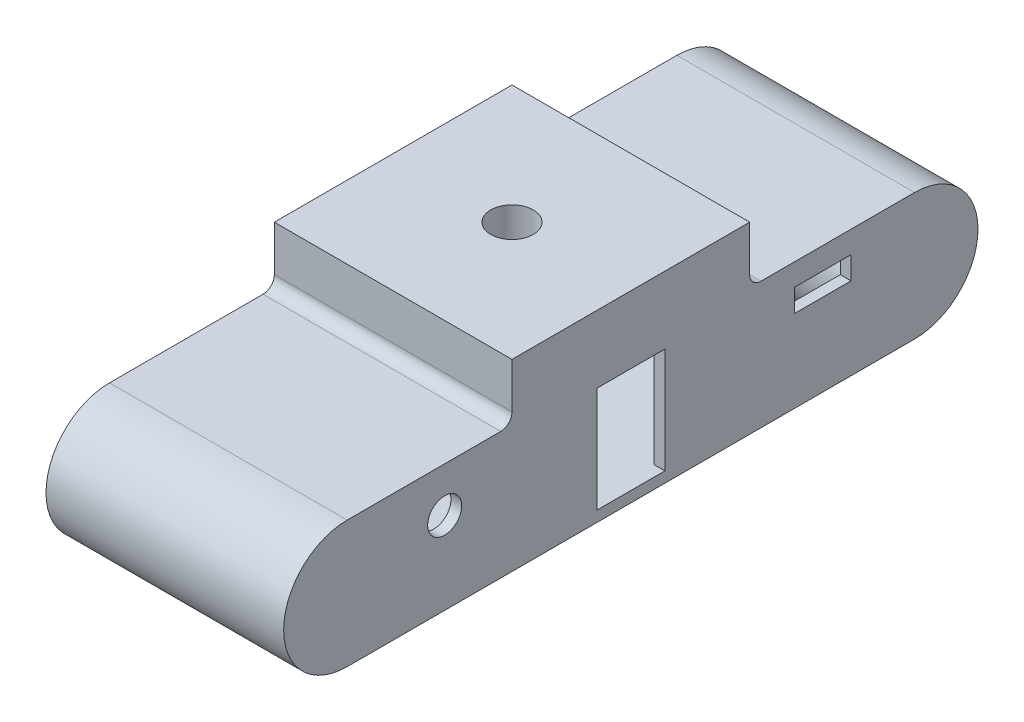
ISO-10303-21;
HEADER;
FILE_DESCRIPTION(('STEP AP214'),'2;1');
FILE_NAME('part.step','',(''),(''),'','','');
FILE_SCHEMA(('AUTOMOTIVE_DESIGN { 1 0 10303 214 1 1 1 1 }'));
ENDSEC;
DATA;
#1=APPLICATION_CONTEXT('core data for automotive mechanical design processes');
#2=APPLICATION_PROTOCOL_DEFINITION('international standard','automotive_design',2000,#1);
#3=PRODUCT_CONTEXT('',#1,'mechanical');
#4=PRODUCT('Part','Part','',(#3));
#5=PRODUCT_RELATED_PRODUCT_CATEGORY('part','',(#4));
#6=PRODUCT_DEFINITION_FORMATION('','',#4);
#7=PRODUCT_DEFINITION_CONTEXT('part definition',#1,'design');
#8=PRODUCT_DEFINITION('design','',#6,#7);
#9=PRODUCT_DEFINITION_SHAPE('','',#8);
#10=(LENGTH_UNIT() NAMED_UNIT(*) SI_UNIT(.MILLI.,.METRE.));
#11=(NAMED_UNIT(*) PLANE_ANGLE_UNIT() SI_UNIT($,.RADIAN.));
#12=(NAMED_UNIT(*) SI_UNIT($,.STERADIAN.) SOLID_ANGLE_UNIT());
#13=UNCERTAINTY_MEASURE_WITH_UNIT(LENGTH_MEASURE(1.E-05),#10,'distance_accuracy_value','');
#14=(GEOMETRIC_REPRESENTATION_CONTEXT(3) GLOBAL_UNCERTAINTY_ASSIGNED_CONTEXT((#13)) GLOBAL_UNIT_ASSIGNED_CONTEXT((#10,
#11,#12)) REPRESENTATION_CONTEXT('',''));
#15=CARTESIAN_POINT('',(0.,0.,0.));
#16=DIRECTION('',(0.,0.,1.));
#17=DIRECTION('',(1.,0.,0.));
#18=AXIS2_PLACEMENT_3D('',#15,#16,#17);
#19=CARTESIAN_POINT('',(50.8,14.210999772,63.5));
#20=DIRECTION('',(0.,-1.,0.));
#21=DIRECTION('',(0.,0.,-1.));
#22=AXIS2_PLACEMENT_3D('',#19,#20,#21);
#23=PLANE('',#22);
#24=DIRECTION('',(0.,0.,1.));
#25=VECTOR('',#24,1.);
#26=CARTESIAN_POINT('',(53.199999772,14.210999772,-63.5));
#27=LINE('',#26,#25);
#28=CARTESIAN_POINT('',(53.199999772,14.210999772,29.139999886));
#29=VERTEX_POINT('',#28);
#30=CARTESIAN_POINT('',(53.199999772,14.210999772,63.5));
#31=VERTEX_POINT('',#30);
#32=EDGE_CURVE('E282',#29,#31,#27,.T.);
#33=ORIENTED_EDGE('',*,*,#32,.F.);
#34=DIRECTION('',(1.,0.,0.));
#35=VECTOR('',#34,1.);
#36=CARTESIAN_POINT('',(0.,14.210999772,29.139999886));
#37=LINE('',#36,#35);
#38=CARTESIAN_POINT('',(0.,14.210999772,29.139999886));
#39=VERTEX_POINT('',#38);
#40=EDGE_CURVE('E420',#29,#39,#37,.F.);
#41=ORIENTED_EDGE('',*,*,#40,.T.);
#42=DIRECTION('',(0.,0.,1.));
#43=VECTOR('',#42,1.);
#44=CARTESIAN_POINT('',(0.,14.210999772,63.5));
#45=LINE('',#44,#43);
#46=CARTESIAN_POINT('',(0.,14.210999772,63.5));
#47=VERTEX_POINT('',#46);
#48=EDGE_CURVE('E368',#39,#47,#45,.T.);
#49=ORIENTED_EDGE('',*,*,#48,.T.);
#50=DIRECTION('',(-1.,0.,0.));
#51=VECTOR('',#50,1.);
#52=CARTESIAN_POINT('',(50.8,14.210999772,63.5));
#53=LINE('',#52,#51);
#54=EDGE_CURVE('E372',#31,#47,#53,.T.);
#55=ORIENTED_EDGE('',*,*,#54,.F.);
#56=EDGE_LOOP('',(#33,#41,#49,#55));
#57=FACE_BOUND('',#56,.T.);
#58=ADVANCED_FACE('F39',(#57),#23,.F.);
#59=CARTESIAN_POINT('',(0.,14.210999772,-63.5));
#60=VERTEX_POINT('',#59);
#61=CARTESIAN_POINT('',(0.,14.210999772,-29.139999886));
#62=VERTEX_POINT('',#61);
#63=EDGE_CURVE('E369',#60,#62,#45,.T.);
#64=ORIENTED_EDGE('',*,*,#63,.T.);
#65=DIRECTION('',(-1.,0.,0.));
#66=VECTOR('',#65,1.);
#67=CARTESIAN_POINT('',(53.199999772,14.210999772,-29.139999886));
#68=LINE('',#67,#66);
#69=CARTESIAN_POINT('',(53.199999772,14.210999772,-29.139999886));
#70=VERTEX_POINT('',#69);
#71=EDGE_CURVE('E61',#62,#70,#68,.F.);
#72=ORIENTED_EDGE('',*,*,#71,.T.);
#73=CARTESIAN_POINT('',(53.199999772,14.210999772,-63.5));
#74=VERTEX_POINT('',#73);
#75=EDGE_CURVE('E283',#74,#70,#27,.T.);
#76=ORIENTED_EDGE('',*,*,#75,.F.);
#77=DIRECTION('',(-1.,0.,0.));
#78=VECTOR('',#77,1.);
#79=CARTESIAN_POINT('',(50.8,14.210999772,-63.5));
#80=LINE('',#79,#78);
#81=EDGE_CURVE('E376',#74,#60,#80,.T.);
#82=ORIENTED_EDGE('',*,*,#81,.T.);
#83=EDGE_LOOP('',(#64,#72,#76,#82));
#84=FACE_BOUND('',#83,.T.);
#85=ADVANCED_FACE('F454',(#84),#23,.F.);
#86=CARTESIAN_POINT('',(50.8,0.,-63.5));
#87=DIRECTION('',(1.,0.,0.));
#88=DIRECTION('',(0.,0.,-1.));
#89=AXIS2_PLACEMENT_3D('',#86,#87,#88);
#90=PLANE('',#89);
#91=DIRECTION('',(0.,0.,1.));
#92=VECTOR('',#91,1.);
#93=CARTESIAN_POINT('',(50.8,4.191,-49.289000228));
#94=LINE('',#93,#92);
#95=CARTESIAN_POINT('',(50.8,4.191,-49.289000228));
#96=VERTEX_POINT('',#95);
#97=CARTESIAN_POINT('',(50.8,4.191,-36.589000228));
#98=VERTEX_POINT('',#97);
#99=EDGE_CURVE('E233',#96,#98,#94,.T.);
#100=ORIENTED_EDGE('',*,*,#99,.F.);
#101=DIRECTION('',(0.,-1.,0.));
#102=VECTOR('',#101,1.);
#103=CARTESIAN_POINT('',(50.8,4.191,-49.289000228));
#104=LINE('',#103,#102);
#105=CARTESIAN_POINT('',(50.8,9.271,-49.289000228));
#106=VERTEX_POINT('',#105);
#107=EDGE_CURVE('E230',#106,#96,#104,.T.);
#108=ORIENTED_EDGE('',*,*,#107,.F.);
#109=DIRECTION('',(0.,0.,-1.));
#110=VECTOR('',#109,1.);
#111=CARTESIAN_POINT('',(50.8,9.271,-49.289000228));
#112=LINE('',#111,#110);
#113=CARTESIAN_POINT('',(50.8,9.271,-36.589000228));
#114=VERTEX_POINT('',#113);
#115=EDGE_CURVE('E242',#114,#106,#112,.T.);
#116=ORIENTED_EDGE('',*,*,#115,.F.);
#117=DIRECTION('',(0.,1.,0.));
#118=VECTOR('',#117,1.);
#119=CARTESIAN_POINT('',(50.8,4.191,-36.589000228));
#120=LINE('',#119,#118);
#121=EDGE_CURVE('E238',#98,#114,#120,.T.);
#122=ORIENTED_EDGE('',*,*,#121,.F.);
#123=EDGE_LOOP('',(#100,#108,#116,#122));
#124=FACE_BOUND('',#123,.T.);
#125=DIRECTION('',(0.,-1.,0.));
#126=VECTOR('',#125,1.);
#127=CARTESIAN_POINT('',(50.8,11.811,-7.62));
#128=LINE('',#127,#126);
#129=CARTESIAN_POINT('',(50.8,11.811,-7.62));
#130=VERTEX_POINT('',#129);
#131=CARTESIAN_POINT('',(50.8,-11.811,-7.62));
#132=VERTEX_POINT('',#131);
#133=EDGE_CURVE('E219',#130,#132,#128,.T.);
#134=ORIENTED_EDGE('',*,*,#133,.F.);
#135=DIRECTION('',(0.,0.,1.));
#136=VECTOR('',#135,1.);
#137=CARTESIAN_POINT('',(50.8,11.811,55.5972920135067));
#138=LINE('',#137,#136);
#139=CARTESIAN_POINT('',(50.8,11.811,-55.5972920135067));
#140=VERTEX_POINT('',#139);
#141=EDGE_CURVE('E310',#140,#130,#138,.T.);
#142=ORIENTED_EDGE('',*,*,#141,.F.);
#143=CARTESIAN_POINT('',(50.8,0.,-63.5));
#144=DIRECTION('',(-1.,0.,0.));
#145=DIRECTION('',(0.,0.,-1.));
#146=AXIS2_PLACEMENT_3D('',#143,#144,#145);
#147=CIRCLE('',#146,14.210999772);
#148=CARTESIAN_POINT('',(50.8,-11.811,-55.5972920135067));
#149=VERTEX_POINT('',#148);
#150=EDGE_CURVE('E305',#149,#140,#147,.T.);
#151=ORIENTED_EDGE('',*,*,#150,.F.);
#152=DIRECTION('',(0.,0.,-1.));
#153=VECTOR('',#152,1.);
#154=CARTESIAN_POINT('',(50.8,-11.811,55.5972920135067));
#155=LINE('',#154,#153);
#156=EDGE_CURVE('E299',#132,#149,#155,.T.);
#157=ORIENTED_EDGE('',*,*,#156,.F.);
#158=EDGE_LOOP('',(#134,#142,#151,#157));
#159=FACE_BOUND('',#158,.T.);
#160=ADVANCED_FACE('F496',(#124,#159),#90,.F.);
#161=CARTESIAN_POINT('',(50.8,4.191,41.669000228));
#162=DIRECTION('',(-1.,0.,0.));
#163=DIRECTION('',(0.,0.,1.));
#164=AXIS2_PLACEMENT_3D('',#161,#162,#163);
#165=CIRCLE('',#164,3.81);
#166=CARTESIAN_POINT('',(50.8,4.191,45.479000228));
#167=VERTEX_POINT('',#166);
#168=EDGE_CURVE('E234',#167,#167,#165,.T.);
#169=ORIENTED_EDGE('',*,*,#168,.F.);
#170=EDGE_LOOP('',(#169));
#171=FACE_BOUND('',#170,.T.);
#172=DIRECTION('',(0.,1.,0.));
#173=VECTOR('',#172,1.);
#174=CARTESIAN_POINT('',(50.8,11.811,7.62));
#175=LINE('',#174,#173);
#176=CARTESIAN_POINT('',(50.8,-11.811,7.62));
#177=VERTEX_POINT('',#176);
#178=CARTESIAN_POINT('',(50.8,11.811,7.62));
#179=VERTEX_POINT('',#178);
#180=EDGE_CURVE('E224',#177,#179,#175,.T.);
#181=ORIENTED_EDGE('',*,*,#180,.F.);
#182=CARTESIAN_POINT('',(50.8,-11.811,55.5972920135067));
#183=VERTEX_POINT('',#182);
#184=EDGE_CURVE('E301',#183,#177,#155,.T.);
#185=ORIENTED_EDGE('',*,*,#184,.F.);
#186=CARTESIAN_POINT('',(50.8,0.,63.5));
#187=DIRECTION('',(-1.,0.,0.));
#188=DIRECTION('',(0.,0.,-1.));
#189=AXIS2_PLACEMENT_3D('',#186,#187,#188);
#190=CIRCLE('',#189,14.210999772);
#191=CARTESIAN_POINT('',(50.8,11.811,55.5972920135067));
#192=VERTEX_POINT('',#191);
#193=EDGE_CURVE('E295',#192,#183,#190,.T.);
#194=ORIENTED_EDGE('',*,*,#193,.F.);
#195=EDGE_CURVE('E309',#179,#192,#138,.T.);
#196=ORIENTED_EDGE('',*,*,#195,.F.);
#197=EDGE_LOOP('',(#181,#185,#194,#196));
#198=FACE_BOUND('',#197,.T.);
#199=ADVANCED_FACE('F558',(#171,#198),#90,.F.);
#200=CARTESIAN_POINT('',(0.,0.,63.5));
#201=DIRECTION('',(1.,0.,0.));
#202=DIRECTION('',(0.,0.,-1.));
#203=AXIS2_PLACEMENT_3D('',#200,#201,#202);
#204=PLANE('',#203);
#205=CARTESIAN_POINT('',(0.,0.,-63.5));
#206=DIRECTION('',(1.,0.,0.));
#207=DIRECTION('',(0.,0.,-1.));
#208=AXIS2_PLACEMENT_3D('',#205,#206,#207);
#209=CIRCLE('',#208,11.811);
#210=CARTESIAN_POINT('',(0.,0.,-75.311));
#211=VERTEX_POINT('',#210);
#212=EDGE_CURVE('E344',#211,#211,#209,.T.);
#213=ORIENTED_EDGE('',*,*,#212,.T.);
#214=EDGE_LOOP('',(#213));
#215=FACE_BOUND('',#214,.T.);
#216=CARTESIAN_POINT('',(0.,0.,63.5));
#217=DIRECTION('',(1.,0.,0.));
#218=DIRECTION('',(0.,0.,-1.));
#219=AXIS2_PLACEMENT_3D('',#216,#217,#218);
#220=CIRCLE('',#219,11.811);
#221=CARTESIAN_POINT('',(0.,0.,51.689));
#222=VERTEX_POINT('',#221);
#223=EDGE_CURVE('E351',#222,#222,#220,.T.);
#224=ORIENTED_EDGE('',*,*,#223,.T.);
#225=EDGE_LOOP('',(#224));
#226=FACE_BOUND('',#225,.T.);
#227=CARTESIAN_POINT('',(0.,0.,63.5));
#228=DIRECTION('',(1.,0.,0.));
#229=DIRECTION('',(0.,0.,-1.));
#230=AXIS2_PLACEMENT_3D('',#227,#228,#229);
#231=CIRCLE('',#230,14.210999772);
#232=CARTESIAN_POINT('',(0.,-14.210999772,63.5));
#233=VERTEX_POINT('',#232);
#234=EDGE_CURVE('E358',#47,#233,#231,.T.);
#235=ORIENTED_EDGE('',*,*,#234,.F.);
#236=ORIENTED_EDGE('',*,*,#48,.F.);
#237=CARTESIAN_POINT('',(0.,16.750999772,29.139999886));
#238=DIRECTION('',(1.,0.,0.));
#239=DIRECTION('',(0.,0.,-1.));
#240=AXIS2_PLACEMENT_3D('',#237,#238,#239);
#241=CIRCLE('',#240,2.54);
#242=CARTESIAN_POINT('',(0.,16.750999772,26.599999886));
#243=VERTEX_POINT('',#242);
#244=EDGE_CURVE('E217',#39,#243,#241,.T.);
#245=ORIENTED_EDGE('',*,*,#244,.T.);
#246=DIRECTION('',(0.,-1.,0.));
#247=VECTOR('',#246,1.);
#248=CARTESIAN_POINT('',(0.,26.910999772,26.599999886));
#249=LINE('',#248,#247);
#250=CARTESIAN_POINT('',(0.,26.910999772,26.599999886));
#251=VERTEX_POINT('',#250);
#252=EDGE_CURVE('E194',#251,#243,#249,.T.);
#253=ORIENTED_EDGE('',*,*,#252,.F.);
#254=DIRECTION('',(0.,0.,1.));
#255=VECTOR('',#254,1.);
#256=CARTESIAN_POINT('',(0.,26.910999772,26.599999886));
#257=LINE('',#256,#255);
#258=CARTESIAN_POINT('',(0.,26.910999772,-26.599999886));
#259=VERTEX_POINT('',#258);
#260=EDGE_CURVE('E202',#259,#251,#257,.T.);
#261=ORIENTED_EDGE('',*,*,#260,.F.);
#262=DIRECTION('',(0.,-1.,0.));
#263=VECTOR('',#262,1.);
#264=CARTESIAN_POINT('',(0.,26.910999772,-26.599999886));
#265=LINE('',#264,#263);
#266=CARTESIAN_POINT('',(0.,16.750999772,-26.599999886));
#267=VERTEX_POINT('',#266);
#268=EDGE_CURVE('E462',#259,#267,#265,.T.);
#269=ORIENTED_EDGE('',*,*,#268,.T.);
#270=CARTESIAN_POINT('',(0.,16.750999772,-29.139999886));
#271=DIRECTION('',(1.,0.,0.));
#272=DIRECTION('',(0.,0.,-1.));
#273=AXIS2_PLACEMENT_3D('',#270,#271,#272);
#274=CIRCLE('',#273,2.54);
#275=EDGE_CURVE('E48',#267,#62,#274,.T.);
#276=ORIENTED_EDGE('',*,*,#275,.T.);
#277=ORIENTED_EDGE('',*,*,#63,.F.);
#278=CARTESIAN_POINT('',(0.,0.,-63.5));
#279=DIRECTION('',(1.,0.,0.));
#280=DIRECTION('',(0.,0.,-1.));
#281=AXIS2_PLACEMENT_3D('',#278,#279,#280);
#282=CIRCLE('',#281,14.210999772);
#283=CARTESIAN_POINT('',(0.,-14.210999772,-63.5));
#284=VERTEX_POINT('',#283);
#285=EDGE_CURVE('E365',#284,#60,#282,.T.);
#286=ORIENTED_EDGE('',*,*,#285,.F.);
#287=DIRECTION('',(0.,0.,-1.));
#288=VECTOR('',#287,1.);
#289=CARTESIAN_POINT('',(0.,-14.210999772,63.5));
#290=LINE('',#289,#288);
#291=EDGE_CURVE('E362',#233,#284,#290,.T.);
#292=ORIENTED_EDGE('',*,*,#291,.F.);
#293=EDGE_LOOP('',(#235,#236,#245,#253,#261,#269,#276,#277,#286,#292));
#294=FACE_BOUND('',#293,.T.);
#295=CARTESIAN_POINT('',(0.,0.,63.5));
#296=DIRECTION('',(-1.,0.,0.));
#297=DIRECTION('',(0.,0.,-1.));
#298=AXIS2_PLACEMENT_3D('',#295,#296,#297);
#299=CIRCLE('',#298,14.210999772);
#300=CARTESIAN_POINT('',(0.,11.811,55.5972920135067));
#301=VERTEX_POINT('',#300);
#302=CARTESIAN_POINT('',(0.,-11.811,55.5972920135067));
#303=VERTEX_POINT('',#302);
#304=EDGE_CURVE('E315',#301,#303,#299,.T.);
#305=ORIENTED_EDGE('',*,*,#304,.T.);
#306=DIRECTION('',(0.,0.,-1.));
#307=VECTOR('',#306,1.);
#308=CARTESIAN_POINT('',(0.,-11.811,55.5972920135067));
#309=LINE('',#308,#307);
#310=CARTESIAN_POINT('',(0.,-11.811,-55.5972920135067));
#311=VERTEX_POINT('',#310);
#312=EDGE_CURVE('E319',#303,#311,#309,.T.);
#313=ORIENTED_EDGE('',*,*,#312,.T.);
#314=CARTESIAN_POINT('',(0.,0.,-63.5));
#315=DIRECTION('',(-1.,0.,0.));
#316=DIRECTION('',(0.,0.,-1.));
#317=AXIS2_PLACEMENT_3D('',#314,#315,#316);
#318=CIRCLE('',#317,14.210999772);
#319=CARTESIAN_POINT('',(0.,11.811,-55.5972920135067));
#320=VERTEX_POINT('',#319);
#321=EDGE_CURVE('E324',#311,#320,#318,.T.);
#322=ORIENTED_EDGE('',*,*,#321,.T.);
#323=DIRECTION('',(0.,0.,1.));
#324=VECTOR('',#323,1.);
#325=CARTESIAN_POINT('',(0.,11.811,55.5972920135067));
#326=LINE('',#325,#324);
#327=EDGE_CURVE('E300',#320,#301,#326,.T.);
#328=ORIENTED_EDGE('',*,*,#327,.T.);
#329=EDGE_LOOP('',(#305,#313,#322,#328));
#330=FACE_BOUND('',#329,.T.);
#331=ADVANCED_FACE('F213',(#215,#226,#294,#330),#204,.F.);
#332=CARTESIAN_POINT('',(50.8,0.,63.5));
#333=DIRECTION('',(-1.,0.,0.));
#334=DIRECTION('',(0.,0.,1.));
#335=AXIS2_PLACEMENT_3D('',#332,#333,#334);
#336=CYLINDRICAL_SURFACE('',#335,14.210999772);
#337=ORIENTED_EDGE('',*,*,#234,.T.);
#338=DIRECTION('',(-1.,0.,0.));
#339=VECTOR('',#338,1.);
#340=CARTESIAN_POINT('',(50.8,-14.210999772,63.5));
#341=LINE('',#340,#339);
#342=CARTESIAN_POINT('',(53.199999772,-14.210999772,63.5));
#343=VERTEX_POINT('',#342);
#344=EDGE_CURVE('E384',#343,#233,#341,.T.);
#345=ORIENTED_EDGE('',*,*,#344,.F.);
#346=CARTESIAN_POINT('',(53.199999772,0.,63.5));
#347=DIRECTION('',(1.,0.,0.));
#348=DIRECTION('',(0.,0.,-1.));
#349=AXIS2_PLACEMENT_3D('',#346,#347,#348);
#350=CIRCLE('',#349,14.210999772);
#351=EDGE_CURVE('E286',#31,#343,#350,.T.);
#352=ORIENTED_EDGE('',*,*,#351,.F.);
#353=ORIENTED_EDGE('',*,*,#54,.T.);
#354=EDGE_LOOP('',(#337,#345,#352,#353));
#355=FACE_BOUND('',#354,.T.);
#356=ADVANCED_FACE('F447',(#355),#336,.T.);
#357=CARTESIAN_POINT('',(50.8,-14.210999772,63.5));
#358=DIRECTION('',(0.,1.,0.));
#359=DIRECTION('',(0.,0.,1.));
#360=AXIS2_PLACEMENT_3D('',#357,#358,#359);
#361=PLANE('',#360);
#362=ORIENTED_EDGE('',*,*,#291,.T.);
#363=DIRECTION('',(-1.,0.,0.));
#364=VECTOR('',#363,1.);
#365=CARTESIAN_POINT('',(50.8,-14.210999772,-63.5));
#366=LINE('',#365,#364);
#367=CARTESIAN_POINT('',(53.199999772,-14.210999772,-63.5));
#368=VERTEX_POINT('',#367);
#369=EDGE_CURVE('E380',#368,#284,#366,.T.);
#370=ORIENTED_EDGE('',*,*,#369,.F.);
#371=DIRECTION('',(0.,0.,-1.));
#372=VECTOR('',#371,1.);
#373=CARTESIAN_POINT('',(53.199999772,-14.210999772,63.5));
#374=LINE('',#373,#372);
#375=EDGE_CURVE('E290',#343,#368,#374,.T.);
#376=ORIENTED_EDGE('',*,*,#375,.F.);
#377=ORIENTED_EDGE('',*,*,#344,.T.);
#378=EDGE_LOOP('',(#362,#370,#376,#377));
#379=FACE_BOUND('',#378,.T.);
#380=ADVANCED_FACE('F449',(#379),#361,.F.);
#381=CARTESIAN_POINT('',(50.8,0.,-63.5));
#382=DIRECTION('',(-1.,0.,0.));
#383=DIRECTION('',(0.,0.,1.));
#384=AXIS2_PLACEMENT_3D('',#381,#382,#383);
#385=CYLINDRICAL_SURFACE('',#384,14.210999772);
#386=ORIENTED_EDGE('',*,*,#285,.T.);
#387=ORIENTED_EDGE('',*,*,#81,.F.);
#388=CARTESIAN_POINT('',(53.199999772,0.,-63.5));
#389=DIRECTION('',(1.,0.,0.));
#390=DIRECTION('',(0.,0.,-1.));
#391=AXIS2_PLACEMENT_3D('',#388,#389,#390);
#392=CIRCLE('',#391,14.210999772);
#393=EDGE_CURVE('E278',#368,#74,#392,.T.);
#394=ORIENTED_EDGE('',*,*,#393,.F.);
#395=ORIENTED_EDGE('',*,*,#369,.T.);
#396=EDGE_LOOP('',(#386,#387,#394,#395));
#397=FACE_BOUND('',#396,.T.);
#398=ADVANCED_FACE('F452',(#397),#385,.T.);
#399=CARTESIAN_POINT('',(50.8,0.,63.5));
#400=DIRECTION('',(-1.,0.,0.));
#401=DIRECTION('',(0.,0.,1.));
#402=AXIS2_PLACEMENT_3D('',#399,#400,#401);
#403=CYLINDRICAL_SURFACE('',#402,11.811);
#404=CARTESIAN_POINT('',(50.8,0.,63.5));
#405=DIRECTION('',(1.,0.,0.));
#406=DIRECTION('',(0.,0.,-1.));
#407=AXIS2_PLACEMENT_3D('',#404,#405,#406);
#408=CIRCLE('',#407,11.811);
#409=CARTESIAN_POINT('',(50.8,0.,51.689));
#410=VERTEX_POINT('',#409);
#411=EDGE_CURVE('E320',#410,#410,#408,.T.);
#412=ORIENTED_EDGE('',*,*,#411,.T.);
#413=EDGE_LOOP('',(#412));
#414=FACE_BOUND('',#413,.T.);
#415=ORIENTED_EDGE('',*,*,#223,.F.);
#416=EDGE_LOOP('',(#415));
#417=FACE_BOUND('',#416,.T.);
#418=ADVANCED_FACE('F502',(#414,#417),#403,.F.);
#419=CARTESIAN_POINT('',(50.8,0.,-63.5));
#420=DIRECTION('',(-1.,0.,0.));
#421=DIRECTION('',(0.,0.,1.));
#422=AXIS2_PLACEMENT_3D('',#419,#420,#421);
#423=CYLINDRICAL_SURFACE('',#422,11.811);
#424=CARTESIAN_POINT('',(50.8,0.,-63.5));
#425=DIRECTION('',(1.,0.,0.));
#426=DIRECTION('',(0.,0.,-1.));
#427=AXIS2_PLACEMENT_3D('',#424,#425,#426);
#428=CIRCLE('',#427,11.811);
#429=CARTESIAN_POINT('',(50.8,0.,-75.311));
#430=VERTEX_POINT('',#429);
#431=EDGE_CURVE('E294',#430,#430,#428,.T.);
#432=ORIENTED_EDGE('',*,*,#431,.T.);
#433=EDGE_LOOP('',(#432));
#434=FACE_BOUND('',#433,.T.);
#435=ORIENTED_EDGE('',*,*,#212,.F.);
#436=EDGE_LOOP('',(#435));
#437=FACE_BOUND('',#436,.T.);
#438=ADVANCED_FACE('F721',(#434,#437),#423,.F.);
#439=CARTESIAN_POINT('',(50.8,0.,63.5));
#440=DIRECTION('',(-1.,0.,0.));
#441=DIRECTION('',(0.,0.,1.));
#442=AXIS2_PLACEMENT_3D('',#439,#440,#441);
#443=CYLINDRICAL_SURFACE('',#442,14.210999772);
#444=ORIENTED_EDGE('',*,*,#304,.F.);
#445=DIRECTION('',(-1.,0.,0.));
#446=VECTOR('',#445,1.);
#447=CARTESIAN_POINT('',(50.8,11.811,55.5972920135067));
#448=LINE('',#447,#446);
#449=EDGE_CURVE('E314',#192,#301,#448,.T.);
#450=ORIENTED_EDGE('',*,*,#449,.F.);
#451=ORIENTED_EDGE('',*,*,#193,.T.);
#452=DIRECTION('',(-1.,0.,0.));
#453=VECTOR('',#452,1.);
#454=CARTESIAN_POINT('',(50.8,-11.811,55.5972920135067));
#455=LINE('',#454,#453);
#456=EDGE_CURVE('E340',#183,#303,#455,.T.);
#457=ORIENTED_EDGE('',*,*,#456,.T.);
#458=EDGE_LOOP('',(#444,#450,#451,#457));
#459=FACE_BOUND('',#458,.T.);
#460=ADVANCED_FACE('F672',(#459),#443,.T.);
#461=CARTESIAN_POINT('',(50.8,-11.811,55.5972920135067));
#462=DIRECTION('',(0.,1.,0.));
#463=DIRECTION('',(0.,0.,1.));
#464=AXIS2_PLACEMENT_3D('',#461,#462,#463);
#465=PLANE('',#464);
#466=ORIENTED_EDGE('',*,*,#312,.F.);
#467=ORIENTED_EDGE('',*,*,#456,.F.);
#468=ORIENTED_EDGE('',*,*,#184,.T.);
#469=DIRECTION('',(-1.,0.,0.));
#470=VECTOR('',#469,1.);
#471=CARTESIAN_POINT('',(54.61,-11.811,7.62));
#472=LINE('',#471,#470);
#473=CARTESIAN_POINT('',(53.199999772,-11.811,7.62));
#474=VERTEX_POINT('',#473);
#475=EDGE_CURVE('E273',#474,#177,#472,.T.);
#476=ORIENTED_EDGE('',*,*,#475,.F.);
#477=DIRECTION('',(0.,0.,-1.));
#478=VECTOR('',#477,1.);
#479=CARTESIAN_POINT('',(53.199999772,-11.811,-63.5));
#480=LINE('',#479,#478);
#481=CARTESIAN_POINT('',(53.199999772,-11.811,-7.62));
#482=VERTEX_POINT('',#481);
#483=EDGE_CURVE('E388',#474,#482,#480,.T.);
#484=ORIENTED_EDGE('',*,*,#483,.T.);
#485=DIRECTION('',(-1.,0.,0.));
#486=VECTOR('',#485,1.);
#487=CARTESIAN_POINT('',(54.61,-11.811,-7.62));
#488=LINE('',#487,#486);
#489=EDGE_CURVE('E267',#482,#132,#488,.T.);
#490=ORIENTED_EDGE('',*,*,#489,.T.);
#491=ORIENTED_EDGE('',*,*,#156,.T.);
#492=DIRECTION('',(-1.,0.,0.));
#493=VECTOR('',#492,1.);
#494=CARTESIAN_POINT('',(50.8,-11.811,-55.5972920135067));
#495=LINE('',#494,#493);
#496=EDGE_CURVE('E337',#149,#311,#495,.T.);
#497=ORIENTED_EDGE('',*,*,#496,.T.);
#498=EDGE_LOOP('',(#466,#467,#468,#476,#484,#490,#491,#497));
#499=FACE_BOUND('',#498,.T.);
#500=ADVANCED_FACE('F668',(#499),#465,.T.);
#501=CARTESIAN_POINT('',(50.8,0.,-63.5));
#502=DIRECTION('',(-1.,0.,0.));
#503=DIRECTION('',(0.,0.,1.));
#504=AXIS2_PLACEMENT_3D('',#501,#502,#503);
#505=CYLINDRICAL_SURFACE('',#504,14.210999772);
#506=ORIENTED_EDGE('',*,*,#321,.F.);
#507=ORIENTED_EDGE('',*,*,#496,.F.);
#508=ORIENTED_EDGE('',*,*,#150,.T.);
#509=DIRECTION('',(-1.,0.,0.));
#510=VECTOR('',#509,1.);
#511=CARTESIAN_POINT('',(50.8,11.811,-55.5972920135067));
#512=LINE('',#511,#510);
#513=EDGE_CURVE('E334',#140,#320,#512,.T.);
#514=ORIENTED_EDGE('',*,*,#513,.T.);
#515=EDGE_LOOP('',(#506,#507,#508,#514));
#516=FACE_BOUND('',#515,.T.);
#517=ADVANCED_FACE('F592',(#516),#505,.T.);
#518=CARTESIAN_POINT('',(50.8,11.811,55.5972920135067));
#519=DIRECTION('',(0.,-1.,0.));
#520=DIRECTION('',(0.,0.,-1.));
#521=AXIS2_PLACEMENT_3D('',#518,#519,#520);
#522=PLANE('',#521);
#523=CARTESIAN_POINT('',(26.599999886,11.811,0.));
#524=DIRECTION('',(0.,-1.,0.));
#525=DIRECTION('',(0.,0.,-1.));
#526=AXIS2_PLACEMENT_3D('',#523,#524,#525);
#527=CIRCLE('',#526,4.76250000000001);
#528=CARTESIAN_POINT('',(26.599999886,11.811,4.76250000000001));
#529=VERTEX_POINT('',#528);
#530=EDGE_CURVE('E210',#529,#529,#527,.T.);
#531=ORIENTED_EDGE('',*,*,#530,.F.);
#532=EDGE_LOOP('',(#531));
#533=FACE_BOUND('',#532,.T.);
#534=ORIENTED_EDGE('',*,*,#327,.F.);
#535=ORIENTED_EDGE('',*,*,#513,.F.);
#536=ORIENTED_EDGE('',*,*,#141,.T.);
#537=DIRECTION('',(-1.,0.,0.));
#538=VECTOR('',#537,1.);
#539=CARTESIAN_POINT('',(54.61,11.811,-7.62));
#540=LINE('',#539,#538);
#541=CARTESIAN_POINT('',(53.199999772,11.811,-7.62));
#542=VERTEX_POINT('',#541);
#543=EDGE_CURVE('E262',#542,#130,#540,.T.);
#544=ORIENTED_EDGE('',*,*,#543,.F.);
#545=DIRECTION('',(0.,0.,1.));
#546=VECTOR('',#545,1.);
#547=CARTESIAN_POINT('',(53.199999772,11.811,-63.5));
#548=LINE('',#547,#546);
#549=CARTESIAN_POINT('',(53.199999772,11.811,7.62));
#550=VERTEX_POINT('',#549);
#551=EDGE_CURVE('E395',#542,#550,#548,.T.);
#552=ORIENTED_EDGE('',*,*,#551,.T.);
#553=DIRECTION('',(-1.,0.,0.));
#554=VECTOR('',#553,1.);
#555=CARTESIAN_POINT('',(54.61,11.811,7.62));
#556=LINE('',#555,#554);
#557=EDGE_CURVE('E270',#550,#179,#556,.T.);
#558=ORIENTED_EDGE('',*,*,#557,.T.);
#559=ORIENTED_EDGE('',*,*,#195,.T.);
#560=ORIENTED_EDGE('',*,*,#449,.T.);
#561=EDGE_LOOP('',(#534,#535,#536,#544,#552,#558,#559,#560));
#562=FACE_BOUND('',#561,.T.);
#563=ADVANCED_FACE('F586',(#533,#562),#522,.T.);
#564=ORIENTED_EDGE('',*,*,#431,.F.);
#565=EDGE_LOOP('',(#564));
#566=FACE_BOUND('',#565,.T.);
#567=ADVANCED_FACE('F591',(#566),#90,.F.);
#568=ORIENTED_EDGE('',*,*,#411,.F.);
#569=EDGE_LOOP('',(#568));
#570=FACE_BOUND('',#569,.T.);
#571=ADVANCED_FACE('F545',(#570),#90,.F.);
#572=CARTESIAN_POINT('',(53.199999772,0.,-63.5));
#573=DIRECTION('',(1.,0.,0.));
#574=DIRECTION('',(0.,0.,-1.));
#575=AXIS2_PLACEMENT_3D('',#572,#573,#574);
#576=PLANE('',#575);
#577=DIRECTION('',(0.,1.,0.));
#578=VECTOR('',#577,1.);
#579=CARTESIAN_POINT('',(53.199999772,0.,-49.289000228));
#580=LINE('',#579,#578);
#581=CARTESIAN_POINT('',(53.199999772,4.191,-49.289000228));
#582=VERTEX_POINT('',#581);
#583=CARTESIAN_POINT('',(53.199999772,9.271,-49.289000228));
#584=VERTEX_POINT('',#583);
#585=EDGE_CURVE('E414',#582,#584,#580,.T.);
#586=ORIENTED_EDGE('',*,*,#585,.F.);
#587=DIRECTION('',(0.,0.,-1.));
#588=VECTOR('',#587,1.);
#589=CARTESIAN_POINT('',(53.199999772,4.191,-63.5));
#590=LINE('',#589,#588);
#591=CARTESIAN_POINT('',(53.199999772,4.191,-36.589000228));
#592=VERTEX_POINT('',#591);
#593=EDGE_CURVE('E401',#592,#582,#590,.T.);
#594=ORIENTED_EDGE('',*,*,#593,.F.);
#595=DIRECTION('',(0.,-1.,0.));
#596=VECTOR('',#595,1.);
#597=CARTESIAN_POINT('',(53.199999772,0.,-36.589000228));
#598=LINE('',#597,#596);
#599=CARTESIAN_POINT('',(53.199999772,9.271,-36.589000228));
#600=VERTEX_POINT('',#599);
#601=EDGE_CURVE('E407',#600,#592,#598,.T.);
#602=ORIENTED_EDGE('',*,*,#601,.F.);
#603=DIRECTION('',(0.,0.,1.));
#604=VECTOR('',#603,1.);
#605=CARTESIAN_POINT('',(53.199999772,9.271,-63.5));
#606=LINE('',#605,#604);
#607=EDGE_CURVE('E411',#584,#600,#606,.T.);
#608=ORIENTED_EDGE('',*,*,#607,.F.);
#609=EDGE_LOOP('',(#586,#594,#602,#608));
#610=FACE_BOUND('',#609,.T.);
#611=CARTESIAN_POINT('',(53.199999772,4.191,41.669000228));
#612=DIRECTION('',(1.,0.,0.));
#613=DIRECTION('',(0.,0.,-1.));
#614=AXIS2_PLACEMENT_3D('',#611,#612,#613);
#615=CIRCLE('',#614,3.81);
#616=CARTESIAN_POINT('',(53.199999772,4.191,45.479000228));
#617=VERTEX_POINT('',#616);
#618=EDGE_CURVE('E250',#617,#617,#615,.T.);
#619=ORIENTED_EDGE('',*,*,#618,.F.);
#620=EDGE_LOOP('',(#619));
#621=FACE_BOUND('',#620,.T.);
#622=DIRECTION('',(0.,1.,0.));
#623=VECTOR('',#622,1.);
#624=CARTESIAN_POINT('',(53.199999772,0.,-7.62));
#625=LINE('',#624,#623);
#626=EDGE_CURVE('E398',#482,#542,#625,.T.);
#627=ORIENTED_EDGE('',*,*,#626,.F.);
#628=ORIENTED_EDGE('',*,*,#483,.F.);
#629=DIRECTION('',(0.,-1.,0.));
#630=VECTOR('',#629,1.);
#631=CARTESIAN_POINT('',(53.199999772,0.,7.62));
#632=LINE('',#631,#630);
#633=EDGE_CURVE('E391',#550,#474,#632,.T.);
#634=ORIENTED_EDGE('',*,*,#633,.F.);
#635=ORIENTED_EDGE('',*,*,#551,.F.);
#636=EDGE_LOOP('',(#627,#628,#634,#635));
#637=FACE_BOUND('',#636,.T.);
#638=ORIENTED_EDGE('',*,*,#393,.T.);
#639=ORIENTED_EDGE('',*,*,#75,.T.);
#640=CARTESIAN_POINT('',(53.199999772,16.750999772,-29.139999886));
#641=DIRECTION('',(1.,0.,0.));
#642=DIRECTION('',(0.,0.,-1.));
#643=AXIS2_PLACEMENT_3D('',#640,#641,#642);
#644=CIRCLE('',#643,2.54);
#645=CARTESIAN_POINT('',(53.199999772,16.750999772,-26.599999886));
#646=VERTEX_POINT('',#645);
#647=EDGE_CURVE('E11',#70,#646,#644,.F.);
#648=ORIENTED_EDGE('',*,*,#647,.T.);
#649=DIRECTION('',(0.,-1.,0.));
#650=VECTOR('',#649,1.);
#651=CARTESIAN_POINT('',(53.199999772,26.910999772,-26.599999886));
#652=LINE('',#651,#650);
#653=CARTESIAN_POINT('',(53.199999772,26.910999772,-26.599999886));
#654=VERTEX_POINT('',#653);
#655=EDGE_CURVE('E226',#654,#646,#652,.T.);
#656=ORIENTED_EDGE('',*,*,#655,.F.);
#657=DIRECTION('',(0.,0.,-1.));
#658=VECTOR('',#657,1.);
#659=CARTESIAN_POINT('',(53.199999772,26.910999772,26.599999886));
#660=LINE('',#659,#658);
#661=CARTESIAN_POINT('',(53.199999772,26.910999772,26.599999886));
#662=VERTEX_POINT('',#661);
#663=EDGE_CURVE('E201',#662,#654,#660,.T.);
#664=ORIENTED_EDGE('',*,*,#663,.F.);
#665=DIRECTION('',(0.,-1.,0.));
#666=VECTOR('',#665,1.);
#667=CARTESIAN_POINT('',(53.199999772,26.910999772,26.599999886));
#668=LINE('',#667,#666);
#669=CARTESIAN_POINT('',(53.199999772,16.750999772,26.599999886));
#670=VERTEX_POINT('',#669);
#671=EDGE_CURVE('E197',#662,#670,#668,.T.);
#672=ORIENTED_EDGE('',*,*,#671,.T.);
#673=CARTESIAN_POINT('',(53.199999772,16.750999772,29.139999886));
#674=DIRECTION('',(1.,0.,0.));
#675=DIRECTION('',(0.,0.,-1.));
#676=AXIS2_PLACEMENT_3D('',#673,#674,#675);
#677=CIRCLE('',#676,2.54);
#678=EDGE_CURVE('E429',#670,#29,#677,.F.);
#679=ORIENTED_EDGE('',*,*,#678,.T.);
#680=ORIENTED_EDGE('',*,*,#32,.T.);
#681=ORIENTED_EDGE('',*,*,#351,.T.);
#682=ORIENTED_EDGE('',*,*,#375,.T.);
#683=EDGE_LOOP('',(#638,#639,#648,#656,#664,#672,#679,#680,#681,#682));
#684=FACE_BOUND('',#683,.T.);
#685=ADVANCED_FACE('F441',(#610,#621,#637,#684),#576,.T.);
#686=CARTESIAN_POINT('',(54.61,11.811,-7.62));
#687=DIRECTION('',(0.,0.,-1.));
#688=DIRECTION('',(-1.,0.,0.));
#689=AXIS2_PLACEMENT_3D('',#686,#687,#688);
#690=PLANE('',#689);
#691=ORIENTED_EDGE('',*,*,#626,.T.);
#692=ORIENTED_EDGE('',*,*,#543,.T.);
#693=ORIENTED_EDGE('',*,*,#133,.T.);
#694=ORIENTED_EDGE('',*,*,#489,.F.);
#695=EDGE_LOOP('',(#691,#692,#693,#694));
#696=FACE_BOUND('',#695,.T.);
#697=ADVANCED_FACE('F544',(#696),#690,.F.);
#698=CARTESIAN_POINT('',(54.61,11.811,7.62));
#699=DIRECTION('',(0.,0.,1.));
#700=DIRECTION('',(1.,0.,0.));
#701=AXIS2_PLACEMENT_3D('',#698,#699,#700);
#702=PLANE('',#701);
#703=ORIENTED_EDGE('',*,*,#633,.T.);
#704=ORIENTED_EDGE('',*,*,#475,.T.);
#705=ORIENTED_EDGE('',*,*,#180,.T.);
#706=ORIENTED_EDGE('',*,*,#557,.F.);
#707=EDGE_LOOP('',(#703,#704,#705,#706));
#708=FACE_BOUND('',#707,.T.);
#709=ADVANCED_FACE('F646',(#708),#702,.F.);
#710=CARTESIAN_POINT('',(54.61,4.191,41.669000228));
#711=DIRECTION('',(-1.,0.,0.));
#712=DIRECTION('',(0.,0.,1.));
#713=AXIS2_PLACEMENT_3D('',#710,#711,#712);
#714=CYLINDRICAL_SURFACE('',#713,3.81);
#715=CARTESIAN_POINT('',(53.199999772,4.191,45.479000228));
#716=CARTESIAN_POINT('',(53.174999774375,4.191,45.479000228));
#717=CARTESIAN_POINT('',(53.14999977675,4.191,45.479000228));
#718=CARTESIAN_POINT('',(53.0999997815,4.191,45.479000228));
#719=CARTESIAN_POINT('',(53.074999783875,4.191,45.479000228));
#720=CARTESIAN_POINT('',(53.024999788625,4.191,45.479000228));
#721=CARTESIAN_POINT('',(52.999999791,4.191,45.479000228));
#722=CARTESIAN_POINT('',(52.94999979575,4.191,45.479000228));
#723=CARTESIAN_POINT('',(52.924999798125,4.191,45.479000228));
#724=CARTESIAN_POINT('',(52.874999802875,4.191,45.479000228));
#725=CARTESIAN_POINT('',(52.84999980525,4.191,45.479000228));
#726=CARTESIAN_POINT('',(52.79999981,4.191,45.479000228));
#727=CARTESIAN_POINT('',(52.774999812375,4.191,45.479000228));
#728=CARTESIAN_POINT('',(52.724999817125,4.191,45.479000228));
#729=CARTESIAN_POINT('',(52.6999998195,4.191,45.479000228));
#730=CARTESIAN_POINT('',(52.64999982425,4.191,45.479000228));
#731=CARTESIAN_POINT('',(52.624999826625,4.191,45.479000228));
#732=CARTESIAN_POINT('',(52.574999831375,4.191,45.479000228));
#733=CARTESIAN_POINT('',(52.54999983375,4.191,45.479000228));
#734=CARTESIAN_POINT('',(52.4999998385,4.191,45.479000228));
#735=CARTESIAN_POINT('',(52.474999840875,4.191,45.479000228));
#736=CARTESIAN_POINT('',(52.424999845625,4.191,45.479000228));
#737=CARTESIAN_POINT('',(52.399999848,4.191,45.479000228));
#738=CARTESIAN_POINT('',(52.34999985275,4.191,45.479000228));
#739=CARTESIAN_POINT('',(52.324999855125,4.191,45.479000228));
#740=CARTESIAN_POINT('',(52.274999859875,4.191,45.479000228));
#741=CARTESIAN_POINT('',(52.24999986225,4.191,45.479000228));
#742=CARTESIAN_POINT('',(52.199999867,4.191,45.479000228));
#743=CARTESIAN_POINT('',(52.174999869375,4.191,45.479000228));
#744=CARTESIAN_POINT('',(52.124999874125,4.191,45.479000228));
#745=CARTESIAN_POINT('',(52.0999998765,4.191,45.479000228));
#746=CARTESIAN_POINT('',(52.04999988125,4.191,45.479000228));
#747=CARTESIAN_POINT('',(52.024999883625,4.191,45.479000228));
#748=CARTESIAN_POINT('',(51.974999888375,4.191,45.479000228));
#749=CARTESIAN_POINT('',(51.94999989075,4.191,45.479000228));
#750=CARTESIAN_POINT('',(51.8999998955,4.191,45.479000228));
#751=CARTESIAN_POINT('',(51.874999897875,4.191,45.479000228));
#752=CARTESIAN_POINT('',(51.824999902625,4.191,45.479000228));
#753=CARTESIAN_POINT('',(51.799999905,4.191,45.479000228));
#754=CARTESIAN_POINT('',(51.74999990975,4.191,45.479000228));
#755=CARTESIAN_POINT('',(51.724999912125,4.191,45.479000228));
#756=CARTESIAN_POINT('',(51.674999916875,4.191,45.479000228));
#757=CARTESIAN_POINT('',(51.64999991925,4.191,45.479000228));
#758=CARTESIAN_POINT('',(51.599999924,4.191,45.479000228));
#759=CARTESIAN_POINT('',(51.574999926375,4.191,45.479000228));
#760=CARTESIAN_POINT('',(51.524999931125,4.191,45.479000228));
#761=CARTESIAN_POINT('',(51.4999999335,4.191,45.479000228));
#762=CARTESIAN_POINT('',(51.44999993825,4.191,45.479000228));
#763=CARTESIAN_POINT('',(51.424999940625,4.191,45.479000228));
#764=CARTESIAN_POINT('',(51.374999945375,4.191,45.479000228));
#765=CARTESIAN_POINT('',(51.34999994775,4.191,45.479000228));
#766=CARTESIAN_POINT('',(51.2999999525,4.191,45.479000228));
#767=CARTESIAN_POINT('',(51.274999954875,4.191,45.479000228));
#768=CARTESIAN_POINT('',(51.224999959625,4.191,45.479000228));
#769=CARTESIAN_POINT('',(51.199999962,4.191,45.479000228));
#770=CARTESIAN_POINT('',(51.14999996675,4.191,45.479000228));
#771=CARTESIAN_POINT('',(51.124999969125,4.191,45.479000228));
#772=CARTESIAN_POINT('',(51.074999973875,4.191,45.479000228));
#773=CARTESIAN_POINT('',(51.04999997625,4.191,45.479000228));
#774=CARTESIAN_POINT('',(50.999999981,4.191,45.479000228));
#775=CARTESIAN_POINT('',(50.974999983375,4.191,45.479000228));
#776=CARTESIAN_POINT('',(50.924999988125,4.191,45.479000228));
#777=CARTESIAN_POINT('',(50.8999999905,4.191,45.479000228));
#778=CARTESIAN_POINT('',(50.84999999525,4.191,45.479000228));
#779=CARTESIAN_POINT('',(50.824999997625,4.191,45.479000228));
#780=CARTESIAN_POINT('',(50.8,4.191,45.479000228));
#781=B_SPLINE_CURVE_WITH_KNOTS('',3,(#715,#716,#717,#718,#719,#720,#721,#722,#723,#724,#725,
#726,#727,#728,#729,#730,#731,#732,#733,#734,#735,#736,#737,#738,#739,#740,#741,#742,#743,#744,
#745,#746,#747,#748,#749,#750,#751,#752,#753,#754,#755,#756,#757,#758,#759,#760,#761,#762,#763,
#764,#765,#766,#767,#768,#769,#770,#771,#772,#773,#774,#775,#776,#777,#778,#779,#780),
.UNSPECIFIED.,.F.,.F.,(4,2,2,2,2,2,2,2,2,2,2,2,2,2,2,2,2,2,2,2,2,2,2,2,2,2,2,2,2,2,2,2,4),(0.,
0.0749999928750036,0.14999998575,0.224999978625004,0.299999971500001,0.374999964375004,
0.449999957250001,0.524999950125005,0.599999943000001,0.674999935874998,0.749999928750002,
0.824999921624998,0.899999914500002,0.974999907374999,1.04999990025,1.124999893125,1.199999886,
1.274999878875,1.34999987175,1.424999864625,1.4999998575,1.574999850375,1.64999984325,
1.724999836125,1.799999829,1.87499982187499,1.94999981475,2.02499980762499,2.0999998005,
2.17499979337499,2.24999978625,2.32499977912499,2.39999977199999),.UNSPECIFIED.);
#782=EDGE_CURVE('BSEAM636',#617,#167,#781,.T.);
#783=ORIENTED_EDGE('',*,*,#618,.T.);
#784=ORIENTED_EDGE('',*,*,#168,.T.);
#785=ORIENTED_EDGE('',*,*,#782,.T.);
#786=ORIENTED_EDGE('',*,*,#782,.F.);
#787=EDGE_LOOP('',(#783,#785,#784,#786));
#788=FACE_BOUND('',#787,.T.);
#789=ADVANCED_FACE('F636',(#788),#714,.F.);
#790=CARTESIAN_POINT('',(54.61,4.191,-49.289000228));
#791=DIRECTION('',(0.,0.,-1.));
#792=DIRECTION('',(-1.,0.,0.));
#793=AXIS2_PLACEMENT_3D('',#790,#791,#792);
#794=PLANE('',#793);
#795=ORIENTED_EDGE('',*,*,#585,.T.);
#796=DIRECTION('',(-1.,0.,0.));
#797=VECTOR('',#796,1.);
#798=CARTESIAN_POINT('',(54.61,9.271,-49.289000228));
#799=LINE('',#798,#797);
#800=EDGE_CURVE('E247',#584,#106,#799,.T.);
#801=ORIENTED_EDGE('',*,*,#800,.T.);
#802=ORIENTED_EDGE('',*,*,#107,.T.);
#803=DIRECTION('',(-1.,0.,0.));
#804=VECTOR('',#803,1.);
#805=CARTESIAN_POINT('',(54.61,4.191,-49.289000228));
#806=LINE('',#805,#804);
#807=EDGE_CURVE('E246',#582,#96,#806,.T.);
#808=ORIENTED_EDGE('',*,*,#807,.F.);
#809=EDGE_LOOP('',(#795,#801,#802,#808));
#810=FACE_BOUND('',#809,.T.);
#811=ADVANCED_FACE('F626',(#810),#794,.F.);
#812=CARTESIAN_POINT('',(54.61,9.271,-49.289000228));
#813=DIRECTION('',(0.,1.,0.));
#814=DIRECTION('',(0.,0.,1.));
#815=AXIS2_PLACEMENT_3D('',#812,#813,#814);
#816=PLANE('',#815);
#817=ORIENTED_EDGE('',*,*,#607,.T.);
#818=DIRECTION('',(-1.,0.,0.));
#819=VECTOR('',#818,1.);
#820=CARTESIAN_POINT('',(54.61,9.271,-36.589000228));
#821=LINE('',#820,#819);
#822=EDGE_CURVE('E251',#600,#114,#821,.T.);
#823=ORIENTED_EDGE('',*,*,#822,.T.);
#824=ORIENTED_EDGE('',*,*,#115,.T.);
#825=ORIENTED_EDGE('',*,*,#800,.F.);
#826=EDGE_LOOP('',(#817,#823,#824,#825));
#827=FACE_BOUND('',#826,.T.);
#828=ADVANCED_FACE('F616',(#827),#816,.F.);
#829=CARTESIAN_POINT('',(54.61,4.191,-36.589000228));
#830=DIRECTION('',(0.,0.,1.));
#831=DIRECTION('',(1.,0.,0.));
#832=AXIS2_PLACEMENT_3D('',#829,#830,#831);
#833=PLANE('',#832);
#834=ORIENTED_EDGE('',*,*,#601,.T.);
#835=DIRECTION('',(-1.,0.,0.));
#836=VECTOR('',#835,1.);
#837=CARTESIAN_POINT('',(54.61,4.191,-36.589000228));
#838=LINE('',#837,#836);
#839=EDGE_CURVE('E254',#592,#98,#838,.T.);
#840=ORIENTED_EDGE('',*,*,#839,.T.);
#841=ORIENTED_EDGE('',*,*,#121,.T.);
#842=ORIENTED_EDGE('',*,*,#822,.F.);
#843=EDGE_LOOP('',(#834,#840,#841,#842));
#844=FACE_BOUND('',#843,.T.);
#845=ADVANCED_FACE('F606',(#844),#833,.F.);
#846=CARTESIAN_POINT('',(54.61,4.191,-49.289000228));
#847=DIRECTION('',(0.,-1.,0.));
#848=DIRECTION('',(0.,0.,-1.));
#849=AXIS2_PLACEMENT_3D('',#846,#847,#848);
#850=PLANE('',#849);
#851=ORIENTED_EDGE('',*,*,#593,.T.);
#852=ORIENTED_EDGE('',*,*,#807,.T.);
#853=ORIENTED_EDGE('',*,*,#99,.T.);
#854=ORIENTED_EDGE('',*,*,#839,.F.);
#855=EDGE_LOOP('',(#851,#852,#853,#854));
#856=FACE_BOUND('',#855,.T.);
#857=ADVANCED_FACE('F534',(#856),#850,.F.);
#858=CARTESIAN_POINT('',(53.199999772,26.910999772,26.599999886));
#859=DIRECTION('',(0.,0.,-1.));
#860=DIRECTION('',(0.,1.,0.));
#861=AXIS2_PLACEMENT_3D('',#858,#859,#860);
#862=PLANE('',#861);
#863=ORIENTED_EDGE('',*,*,#252,.T.);
#864=DIRECTION('',(1.,0.,0.));
#865=VECTOR('',#864,1.);
#866=CARTESIAN_POINT('',(53.199999772,16.750999772,26.599999886));
#867=LINE('',#866,#865);
#868=EDGE_CURVE('E417',#243,#670,#867,.T.);
#869=ORIENTED_EDGE('',*,*,#868,.T.);
#870=ORIENTED_EDGE('',*,*,#671,.F.);
#871=DIRECTION('',(1.,0.,0.));
#872=VECTOR('',#871,1.);
#873=CARTESIAN_POINT('',(53.199999772,26.910999772,26.599999886));
#874=LINE('',#873,#872);
#875=EDGE_CURVE('E189',#251,#662,#874,.T.);
#876=ORIENTED_EDGE('',*,*,#875,.F.);
#877=EDGE_LOOP('',(#863,#869,#870,#876));
#878=FACE_BOUND('',#877,.T.);
#879=ADVANCED_FACE('F191',(#878),#862,.F.);
#880=CARTESIAN_POINT('',(53.199999772,26.910999772,-26.599999886));
#881=DIRECTION('',(0.,0.,1.));
#882=DIRECTION('',(0.,-1.,0.));
#883=AXIS2_PLACEMENT_3D('',#880,#881,#882);
#884=PLANE('',#883);
#885=ORIENTED_EDGE('',*,*,#655,.T.);
#886=DIRECTION('',(-1.,0.,0.));
#887=VECTOR('',#886,1.);
#888=CARTESIAN_POINT('',(0.,16.750999772,-26.599999886));
#889=LINE('',#888,#887);
#890=EDGE_CURVE('E423',#646,#267,#889,.T.);
#891=ORIENTED_EDGE('',*,*,#890,.T.);
#892=ORIENTED_EDGE('',*,*,#268,.F.);
#893=DIRECTION('',(-1.,0.,0.));
#894=VECTOR('',#893,1.);
#895=CARTESIAN_POINT('',(53.199999772,26.910999772,-26.599999886));
#896=LINE('',#895,#894);
#897=EDGE_CURVE('E207',#654,#259,#896,.T.);
#898=ORIENTED_EDGE('',*,*,#897,.F.);
#899=EDGE_LOOP('',(#885,#891,#892,#898));
#900=FACE_BOUND('',#899,.T.);
#901=ADVANCED_FACE('F461',(#900),#884,.F.);
#902=CARTESIAN_POINT('',(0.,26.910999772,0.));
#903=DIRECTION('',(0.,1.,0.));
#904=DIRECTION('',(0.,0.,1.));
#905=AXIS2_PLACEMENT_3D('',#902,#903,#904);
#906=PLANE('',#905);
#907=CARTESIAN_POINT('',(26.599999886,26.910999772,0.));
#908=DIRECTION('',(0.,1.,0.));
#909=DIRECTION('',(0.,0.,1.));
#910=AXIS2_PLACEMENT_3D('',#907,#908,#909);
#911=CIRCLE('',#910,4.76250000000001);
#912=CARTESIAN_POINT('',(26.599999886,26.910999772,4.76250000000001));
#913=VERTEX_POINT('',#912);
#914=EDGE_CURVE('E474',#913,#913,#911,.T.);
#915=ORIENTED_EDGE('',*,*,#914,.F.);
#916=EDGE_LOOP('',(#915));
#917=FACE_BOUND('',#916,.T.);
#918=ORIENTED_EDGE('',*,*,#260,.T.);
#919=ORIENTED_EDGE('',*,*,#875,.T.);
#920=ORIENTED_EDGE('',*,*,#663,.T.);
#921=ORIENTED_EDGE('',*,*,#897,.T.);
#922=EDGE_LOOP('',(#918,#919,#920,#921));
#923=FACE_BOUND('',#922,.T.);
#924=ADVANCED_FACE('F205',(#917,#923),#906,.T.);
#925=CARTESIAN_POINT('',(26.599999886,10.400999772,0.));
#926=DIRECTION('',(0.,1.,0.));
#927=DIRECTION('',(0.,0.,1.));
#928=AXIS2_PLACEMENT_3D('',#925,#926,#927);
#929=CYLINDRICAL_SURFACE('',#928,4.76250000000001);
#930=CARTESIAN_POINT('',(26.599999886,11.811,4.76250000000001));
#931=CARTESIAN_POINT('',(26.599999886,11.9682916642917,4.76250000000001));
#932=CARTESIAN_POINT('',(26.599999886,12.1255833285833,4.76250000000001));
#933=CARTESIAN_POINT('',(26.599999886,12.4401666571667,4.76250000000001));
#934=CARTESIAN_POINT('',(26.599999886,12.5974583214583,4.76250000000001));
#935=CARTESIAN_POINT('',(26.599999886,12.9120416500417,4.76250000000001));
#936=CARTESIAN_POINT('',(26.599999886,13.0693333143333,4.76250000000001));
#937=CARTESIAN_POINT('',(26.599999886,13.3839166429167,4.76250000000001));
#938=CARTESIAN_POINT('',(26.599999886,13.5412083072083,4.76250000000001));
#939=CARTESIAN_POINT('',(26.599999886,13.8557916357917,4.76250000000001));
#940=CARTESIAN_POINT('',(26.599999886,14.0130833000833,4.76250000000001));
#941=CARTESIAN_POINT('',(26.599999886,14.3276666286667,4.76250000000001));
#942=CARTESIAN_POINT('',(26.599999886,14.4849582929583,4.76250000000001));
#943=CARTESIAN_POINT('',(26.599999886,14.7995416215417,4.76250000000001));
#944=CARTESIAN_POINT('',(26.599999886,14.9568332858333,4.76250000000001));
#945=CARTESIAN_POINT('',(26.599999886,15.2714166144167,4.76250000000001));
#946=CARTESIAN_POINT('',(26.599999886,15.4287082787083,4.76250000000001));
#947=CARTESIAN_POINT('',(26.599999886,15.7432916072917,4.76250000000001));
#948=CARTESIAN_POINT('',(26.599999886,15.9005832715833,4.76250000000001));
#949=CARTESIAN_POINT('',(26.599999886,16.2151666001667,4.76250000000001));
#950=CARTESIAN_POINT('',(26.599999886,16.3724582644583,4.76250000000001));
#951=CARTESIAN_POINT('',(26.599999886,16.6870415930417,4.76250000000001));
#952=CARTESIAN_POINT('',(26.599999886,16.8443332573333,4.76250000000001));
#953=CARTESIAN_POINT('',(26.599999886,17.1589165859167,4.76250000000001));
#954=CARTESIAN_POINT('',(26.599999886,17.3162082502083,4.76250000000001));
#955=CARTESIAN_POINT('',(26.599999886,17.6307915787917,4.76250000000001));
#956=CARTESIAN_POINT('',(26.599999886,17.7880832430833,4.76250000000001));
#957=CARTESIAN_POINT('',(26.599999886,18.1026665716667,4.76250000000001));
#958=CARTESIAN_POINT('',(26.599999886,18.2599582359583,4.76250000000001));
#959=CARTESIAN_POINT('',(26.599999886,18.5745415645417,4.76250000000001));
#960=CARTESIAN_POINT('',(26.599999886,18.7318332288333,4.76250000000001));
#961=CARTESIAN_POINT('',(26.599999886,19.0464165574167,4.76250000000001));
#962=CARTESIAN_POINT('',(26.599999886,19.2037082217083,4.76250000000001));
#963=CARTESIAN_POINT('',(26.599999886,19.5182915502917,4.76250000000001));
#964=CARTESIAN_POINT('',(26.599999886,19.6755832145833,4.76250000000001));
#965=CARTESIAN_POINT('',(26.599999886,19.9901665431667,4.76250000000001));
#966=CARTESIAN_POINT('',(26.599999886,20.1474582074583,4.76250000000001));
#967=CARTESIAN_POINT('',(26.599999886,20.4620415360417,4.76250000000001));
#968=CARTESIAN_POINT('',(26.599999886,20.6193332003333,4.76250000000001));
#969=CARTESIAN_POINT('',(26.599999886,20.9339165289167,4.76250000000001));
#970=CARTESIAN_POINT('',(26.599999886,21.0912081932083,4.76250000000001));
#971=CARTESIAN_POINT('',(26.599999886,21.4057915217917,4.76250000000001));
#972=CARTESIAN_POINT('',(26.599999886,21.5630831860833,4.76250000000001));
#973=CARTESIAN_POINT('',(26.599999886,21.8776665146667,4.76250000000001));
#974=CARTESIAN_POINT('',(26.599999886,22.0349581789583,4.76250000000001));
#975=CARTESIAN_POINT('',(26.599999886,22.3495415075417,4.76250000000001));
#976=CARTESIAN_POINT('',(26.599999886,22.5068331718333,4.76250000000001));
#977=CARTESIAN_POINT('',(26.599999886,22.8214165004167,4.76250000000001));
#978=CARTESIAN_POINT('',(26.599999886,22.9787081647083,4.76250000000001));
#979=CARTESIAN_POINT('',(26.599999886,23.2932914932917,4.76250000000001));
#980=CARTESIAN_POINT('',(26.599999886,23.4505831575833,4.76250000000001));
#981=CARTESIAN_POINT('',(26.599999886,23.7651664861667,4.76250000000001));
#982=CARTESIAN_POINT('',(26.599999886,23.9224581504583,4.76250000000001));
#983=CARTESIAN_POINT('',(26.599999886,24.2370414790417,4.76250000000001));
#984=CARTESIAN_POINT('',(26.599999886,24.3943331433333,4.76250000000001));
#985=CARTESIAN_POINT('',(26.599999886,24.7089164719167,4.76250000000001));
#986=CARTESIAN_POINT('',(26.599999886,24.8662081362083,4.76250000000001));
#987=CARTESIAN_POINT('',(26.599999886,25.1807914647917,4.76250000000001));
#988=CARTESIAN_POINT('',(26.599999886,25.3380831290833,4.76250000000001));
#989=CARTESIAN_POINT('',(26.599999886,25.6526664576667,4.76250000000001));
#990=CARTESIAN_POINT('',(26.599999886,25.8099581219583,4.76250000000001));
#991=CARTESIAN_POINT('',(26.599999886,26.1245414505417,4.76250000000001));
#992=CARTESIAN_POINT('',(26.599999886,26.2818331148333,4.76250000000001));
#993=CARTESIAN_POINT('',(26.599999886,26.5964164434167,4.76250000000001));
#994=CARTESIAN_POINT('',(26.599999886,26.7537081077083,4.76250000000001));
#995=CARTESIAN_POINT('',(26.599999886,26.910999772,4.76250000000001));
#996=B_SPLINE_CURVE_WITH_KNOTS('',3,(#930,#931,#932,#933,#934,#935,#936,#937,#938,#939,#940,
#941,#942,#943,#944,#945,#946,#947,#948,#949,#950,#951,#952,#953,#954,#955,#956,#957,#958,#959,
#960,#961,#962,#963,#964,#965,#966,#967,#968,#969,#970,#971,#972,#973,#974,#975,#976,#977,#978,
#979,#980,#981,#982,#983,#984,#985,#986,#987,#988,#989,#990,#991,#992,#993,#994,#995),
.UNSPECIFIED.,.F.,.F.,(4,2,2,2,2,2,2,2,2,2,2,2,2,2,2,2,2,2,2,2,2,2,2,2,2,2,2,2,2,2,2,2,4),(0.,
0.471874992875002,0.943749985750001,1.415624978625,1.8874999715,2.359374964375,2.83124995725,
3.30312495012501,3.77499994300001,4.24687493587501,4.71874992875001,5.19062492162501,
5.66249991450001,6.13437490737501,6.60624990025001,7.07812489312501,7.54999988600001,
8.02187487887501,8.49374987175001,8.96562486462501,9.43749985750001,9.90937485037501,
10.38124984325,10.853124836125,11.324999829,11.796874821875,12.26874981475,12.740624807625,
13.2124998005,13.684374793375,14.15624978625,14.628124779125,15.099999772),.UNSPECIFIED.);
#997=EDGE_CURVE('BSEAM479',#529,#913,#996,.T.);
#998=ORIENTED_EDGE('',*,*,#530,.T.);
#999=ORIENTED_EDGE('',*,*,#914,.T.);
#1000=ORIENTED_EDGE('',*,*,#997,.T.);
#1001=ORIENTED_EDGE('',*,*,#997,.F.);
#1002=EDGE_LOOP('',(#998,#1000,#999,#1001));
#1003=FACE_BOUND('',#1002,.T.);
#1004=ADVANCED_FACE('F479',(#1003),#929,.F.);
#1005=CARTESIAN_POINT('',(53.199999772,16.750999772,29.139999886));
#1006=DIRECTION('',(-1.,0.,0.));
#1007=DIRECTION('',(0.,0.,1.));
#1008=AXIS2_PLACEMENT_3D('',#1005,#1006,#1007);
#1009=CYLINDRICAL_SURFACE('',#1008,2.54);
#1010=ORIENTED_EDGE('',*,*,#244,.F.);
#1011=ORIENTED_EDGE('',*,*,#40,.F.);
#1012=ORIENTED_EDGE('',*,*,#678,.F.);
#1013=ORIENTED_EDGE('',*,*,#868,.F.);
#1014=EDGE_LOOP('',(#1010,#1011,#1012,#1013));
#1015=FACE_BOUND('',#1014,.T.);
#1016=ADVANCED_FACE('F487',(#1015),#1009,.F.);
#1017=CARTESIAN_POINT('',(53.199999772,16.750999772,-29.139999886));
#1018=DIRECTION('',(1.,0.,0.));
#1019=DIRECTION('',(0.,0.,-1.));
#1020=AXIS2_PLACEMENT_3D('',#1017,#1018,#1019);
#1021=CYLINDRICAL_SURFACE('',#1020,2.54);
#1022=ORIENTED_EDGE('',*,*,#647,.F.);
#1023=ORIENTED_EDGE('',*,*,#71,.F.);
#1024=ORIENTED_EDGE('',*,*,#275,.F.);
#1025=ORIENTED_EDGE('',*,*,#890,.F.);
#1026=EDGE_LOOP('',(#1022,#1023,#1024,#1025));
#1027=FACE_BOUND('',#1026,.T.);
#1028=ADVANCED_FACE('F41',(#1027),#1021,.F.);
#1029=CLOSED_SHELL('',(#58,#85,#160,#199,#331,#356,#380,#398,#418,#438,#460,#500,#517,#563,#567,
#571,#685,#697,#709,#789,#811,#828,#845,#857,#879,#901,#924,#1004,#1016,#1028));
#1030=MANIFOLD_SOLID_BREP('B2',#1029);
#1031=ADVANCED_BREP_SHAPE_REPRESENTATION('',(#18,#1030),#14);
#1032=SHAPE_DEFINITION_REPRESENTATION(#9,#1031);
ENDSEC;
END-ISO-10303-21;
